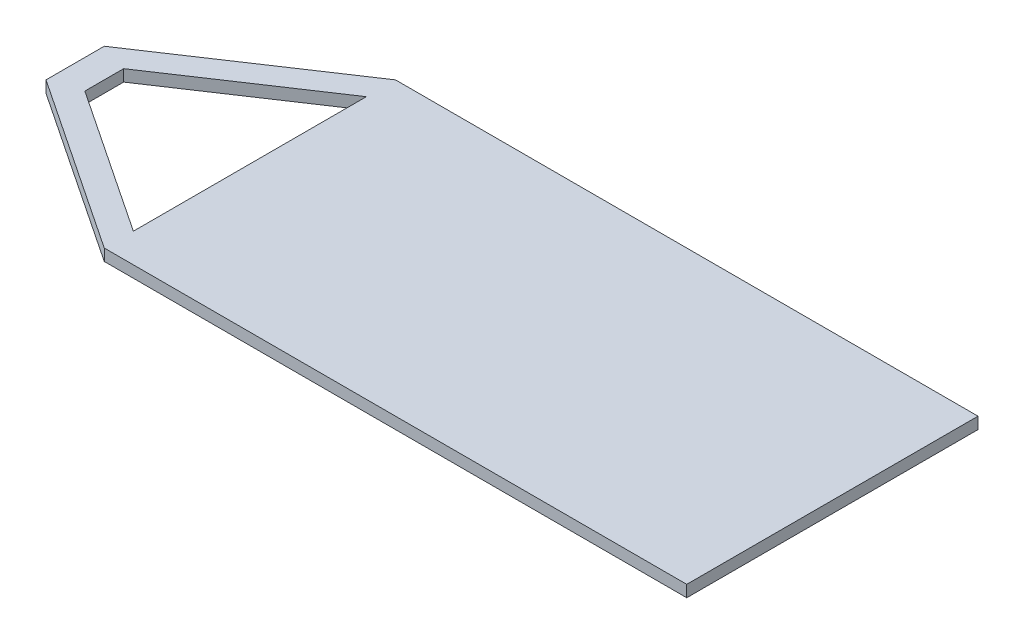
ISO-10303-21;
HEADER;
FILE_DESCRIPTION(('STEP AP214'),'2;1');
FILE_NAME('part.step','',(''),(''),'','','');
FILE_SCHEMA(('AUTOMOTIVE_DESIGN { 1 0 10303 214 1 1 1 1 }'));
ENDSEC;
DATA;
#1=APPLICATION_CONTEXT('core data for automotive mechanical design processes');
#2=APPLICATION_PROTOCOL_DEFINITION('international standard','automotive_design',2000,#1);
#3=PRODUCT_CONTEXT('',#1,'mechanical');
#4=PRODUCT('Part','Part','',(#3));
#5=PRODUCT_RELATED_PRODUCT_CATEGORY('part','',(#4));
#6=PRODUCT_DEFINITION_FORMATION('','',#4);
#7=PRODUCT_DEFINITION_CONTEXT('part definition',#1,'design');
#8=PRODUCT_DEFINITION('design','',#6,#7);
#9=PRODUCT_DEFINITION_SHAPE('','',#8);
#10=(LENGTH_UNIT() NAMED_UNIT(*) SI_UNIT(.MILLI.,.METRE.));
#11=(NAMED_UNIT(*) PLANE_ANGLE_UNIT() SI_UNIT($,.RADIAN.));
#12=(NAMED_UNIT(*) SI_UNIT($,.STERADIAN.) SOLID_ANGLE_UNIT());
#13=UNCERTAINTY_MEASURE_WITH_UNIT(LENGTH_MEASURE(1.E-05),#10,'distance_accuracy_value','');
#14=(GEOMETRIC_REPRESENTATION_CONTEXT(3) GLOBAL_UNCERTAINTY_ASSIGNED_CONTEXT((#13)) GLOBAL_UNIT_ASSIGNED_CONTEXT((#10,
#11,#12)) REPRESENTATION_CONTEXT('',''));
#15=CARTESIAN_POINT('',(0.,0.,0.));
#16=DIRECTION('',(0.,0.,1.));
#17=DIRECTION('',(1.,0.,0.));
#18=AXIS2_PLACEMENT_3D('',#15,#16,#17);
#19=CARTESIAN_POINT('',(0.,2.,0.));
#20=DIRECTION('',(0.,1.,0.));
#21=DIRECTION('',(0.,0.,1.));
#22=AXIS2_PLACEMENT_3D('',#19,#20,#21);
#23=PLANE('',#22);
#24=DIRECTION('',(0.832050294337844,0.,0.554700196225229));
#25=VECTOR('',#24,1.);
#26=CARTESIAN_POINT('',(0.,2.,5.));
#27=LINE('',#26,#25);
#28=CARTESIAN_POINT('',(0.,2.,5.));
#29=VERTEX_POINT('',#28);
#30=CARTESIAN_POINT('',(30.,2.,25.));
#31=VERTEX_POINT('',#30);
#32=EDGE_CURVE('E151',#29,#31,#27,.T.);
#33=ORIENTED_EDGE('',*,*,#32,.T.);
#34=DIRECTION('',(1.,0.,0.));
#35=VECTOR('',#34,1.);
#36=CARTESIAN_POINT('',(30.,2.,25.));
#37=LINE('',#36,#35);
#38=CARTESIAN_POINT('',(130.,2.,24.9999999999999));
#39=VERTEX_POINT('',#38);
#40=EDGE_CURVE('E154',#31,#39,#37,.T.);
#41=ORIENTED_EDGE('',*,*,#40,.T.);
#42=DIRECTION('',(0.,0.,-1.));
#43=VECTOR('',#42,1.);
#44=CARTESIAN_POINT('',(130.,2.,24.9999999999999));
#45=LINE('',#44,#43);
#46=CARTESIAN_POINT('',(130.,2.,-25.));
#47=VERTEX_POINT('',#46);
#48=EDGE_CURVE('E157',#39,#47,#45,.T.);
#49=ORIENTED_EDGE('',*,*,#48,.T.);
#50=DIRECTION('',(-1.,0.,0.));
#51=VECTOR('',#50,1.);
#52=CARTESIAN_POINT('',(30.,2.,-25.));
#53=LINE('',#52,#51);
#54=CARTESIAN_POINT('',(30.,2.,-25.));
#55=VERTEX_POINT('',#54);
#56=EDGE_CURVE('E159',#47,#55,#53,.T.);
#57=ORIENTED_EDGE('',*,*,#56,.T.);
#58=DIRECTION('',(-0.832050294337843,0.,0.55470019622523));
#59=VECTOR('',#58,1.);
#60=CARTESIAN_POINT('',(0.,2.,-5.));
#61=LINE('',#60,#59);
#62=CARTESIAN_POINT('',(0.,2.,-5.));
#63=VERTEX_POINT('',#62);
#64=EDGE_CURVE('E161',#55,#63,#61,.T.);
#65=ORIENTED_EDGE('',*,*,#64,.T.);
#66=DIRECTION('',(0.,0.,1.));
#67=VECTOR('',#66,1.);
#68=CARTESIAN_POINT('',(0.,2.,-5.));
#69=LINE('',#68,#67);
#70=EDGE_CURVE('E163',#63,#29,#69,.T.);
#71=ORIENTED_EDGE('',*,*,#70,.T.);
#72=EDGE_LOOP('',(#33,#41,#49,#57,#65,#71));
#73=FACE_BOUND('',#72,.T.);
#74=DIRECTION('',(0.,0.,1.));
#75=VECTOR('',#74,1.);
#76=CARTESIAN_POINT('',(5.,2.,-3.33333333333332));
#77=LINE('',#76,#75);
#78=CARTESIAN_POINT('',(5.,2.,-3.33333333333332));
#79=VERTEX_POINT('',#78);
#80=CARTESIAN_POINT('',(5.,2.,3.33333333333333));
#81=VERTEX_POINT('',#80);
#82=EDGE_CURVE('E123',#79,#81,#77,.T.);
#83=ORIENTED_EDGE('',*,*,#82,.F.);
#84=DIRECTION('',(-0.832050294337843,0.,0.55470019622523));
#85=VECTOR('',#84,1.);
#86=CARTESIAN_POINT('',(5.,2.,-3.33333333333332));
#87=LINE('',#86,#85);
#88=CARTESIAN_POINT('',(30.,2.,-20.));
#89=VERTEX_POINT('',#88);
#90=EDGE_CURVE('E115',#89,#79,#87,.T.);
#91=ORIENTED_EDGE('',*,*,#90,.F.);
#92=DIRECTION('',(0.,0.,-1.));
#93=VECTOR('',#92,1.);
#94=CARTESIAN_POINT('',(30.,2.,20.));
#95=LINE('',#94,#93);
#96=CARTESIAN_POINT('',(30.,2.,20.));
#97=VERTEX_POINT('',#96);
#98=EDGE_CURVE('E137',#97,#89,#95,.T.);
#99=ORIENTED_EDGE('',*,*,#98,.F.);
#100=DIRECTION('',(0.832050294337844,0.,0.554700196225229));
#101=VECTOR('',#100,1.);
#102=CARTESIAN_POINT('',(5.,2.,3.33333333333333));
#103=LINE('',#102,#101);
#104=EDGE_CURVE('E135',#81,#97,#103,.T.);
#105=ORIENTED_EDGE('',*,*,#104,.F.);
#106=EDGE_LOOP('',(#83,#91,#99,#105));
#107=FACE_BOUND('',#106,.T.);
#108=ADVANCED_FACE('F38',(#73,#107),#23,.T.);
#109=CARTESIAN_POINT('',(0.,0.,0.));
#110=DIRECTION('',(0.,1.,0.));
#111=DIRECTION('',(0.,0.,1.));
#112=AXIS2_PLACEMENT_3D('',#109,#110,#111);
#113=PLANE('',#112);
#114=DIRECTION('',(0.832050294337844,0.,0.554700196225229));
#115=VECTOR('',#114,1.);
#116=CARTESIAN_POINT('',(0.,0.,5.));
#117=LINE('',#116,#115);
#118=CARTESIAN_POINT('',(0.,0.,5.));
#119=VERTEX_POINT('',#118);
#120=CARTESIAN_POINT('',(30.,0.,25.));
#121=VERTEX_POINT('',#120);
#122=EDGE_CURVE('E131',#119,#121,#117,.T.);
#123=ORIENTED_EDGE('',*,*,#122,.F.);
#124=DIRECTION('',(0.,0.,1.));
#125=VECTOR('',#124,1.);
#126=CARTESIAN_POINT('',(0.,0.,-5.));
#127=LINE('',#126,#125);
#128=CARTESIAN_POINT('',(0.,0.,-5.));
#129=VERTEX_POINT('',#128);
#130=EDGE_CURVE('E155',#129,#119,#127,.T.);
#131=ORIENTED_EDGE('',*,*,#130,.F.);
#132=DIRECTION('',(-0.832050294337843,0.,0.55470019622523));
#133=VECTOR('',#132,1.);
#134=CARTESIAN_POINT('',(0.,0.,-5.));
#135=LINE('',#134,#133);
#136=CARTESIAN_POINT('',(30.,0.,-25.));
#137=VERTEX_POINT('',#136);
#138=EDGE_CURVE('E174',#137,#129,#135,.T.);
#139=ORIENTED_EDGE('',*,*,#138,.F.);
#140=DIRECTION('',(-1.,0.,0.));
#141=VECTOR('',#140,1.);
#142=CARTESIAN_POINT('',(30.,0.,-25.));
#143=LINE('',#142,#141);
#144=CARTESIAN_POINT('',(130.,0.,-25.));
#145=VERTEX_POINT('',#144);
#146=EDGE_CURVE('E172',#145,#137,#143,.T.);
#147=ORIENTED_EDGE('',*,*,#146,.F.);
#148=DIRECTION('',(0.,0.,-1.));
#149=VECTOR('',#148,1.);
#150=CARTESIAN_POINT('',(130.,0.,24.9999999999999));
#151=LINE('',#150,#149);
#152=CARTESIAN_POINT('',(130.,0.,24.9999999999999));
#153=VERTEX_POINT('',#152);
#154=EDGE_CURVE('E170',#153,#145,#151,.T.);
#155=ORIENTED_EDGE('',*,*,#154,.F.);
#156=DIRECTION('',(1.,0.,0.));
#157=VECTOR('',#156,1.);
#158=CARTESIAN_POINT('',(30.,0.,25.));
#159=LINE('',#158,#157);
#160=EDGE_CURVE('E168',#121,#153,#159,.T.);
#161=ORIENTED_EDGE('',*,*,#160,.F.);
#162=EDGE_LOOP('',(#123,#131,#139,#147,#155,#161));
#163=FACE_BOUND('',#162,.T.);
#164=DIRECTION('',(-0.832050294337843,0.,0.55470019622523));
#165=VECTOR('',#164,1.);
#166=CARTESIAN_POINT('',(5.,0.,-3.33333333333332));
#167=LINE('',#166,#165);
#168=CARTESIAN_POINT('',(30.,0.,-20.));
#169=VERTEX_POINT('',#168);
#170=CARTESIAN_POINT('',(5.,0.,-3.33333333333332));
#171=VERTEX_POINT('',#170);
#172=EDGE_CURVE('E61',#169,#171,#167,.T.);
#173=ORIENTED_EDGE('',*,*,#172,.T.);
#174=DIRECTION('',(0.,0.,1.));
#175=VECTOR('',#174,1.);
#176=CARTESIAN_POINT('',(5.,0.,-3.33333333333332));
#177=LINE('',#176,#175);
#178=CARTESIAN_POINT('',(5.,0.,3.33333333333333));
#179=VERTEX_POINT('',#178);
#180=EDGE_CURVE('E130',#171,#179,#177,.T.);
#181=ORIENTED_EDGE('',*,*,#180,.T.);
#182=DIRECTION('',(0.832050294337844,0.,0.554700196225229));
#183=VECTOR('',#182,1.);
#184=CARTESIAN_POINT('',(5.,0.,3.33333333333333));
#185=LINE('',#184,#183);
#186=CARTESIAN_POINT('',(30.,0.,20.));
#187=VERTEX_POINT('',#186);
#188=EDGE_CURVE('E143',#179,#187,#185,.T.);
#189=ORIENTED_EDGE('',*,*,#188,.T.);
#190=DIRECTION('',(0.,0.,-1.));
#191=VECTOR('',#190,1.);
#192=CARTESIAN_POINT('',(30.,0.,20.));
#193=LINE('',#192,#191);
#194=EDGE_CURVE('E124',#187,#169,#193,.T.);
#195=ORIENTED_EDGE('',*,*,#194,.T.);
#196=EDGE_LOOP('',(#173,#181,#189,#195));
#197=FACE_BOUND('',#196,.T.);
#198=ADVANCED_FACE('F198',(#163,#197),#113,.F.);
#199=CARTESIAN_POINT('',(0.,2.,5.));
#200=DIRECTION('',(0.554700196225229,0.,-0.832050294337844));
#201=DIRECTION('',(-0.832050294337844,0.,-0.554700196225229));
#202=AXIS2_PLACEMENT_3D('',#199,#200,#201);
#203=PLANE('',#202);
#204=ORIENTED_EDGE('',*,*,#122,.T.);
#205=DIRECTION('',(0.,-1.,0.));
#206=VECTOR('',#205,1.);
#207=CARTESIAN_POINT('',(30.,2.,25.));
#208=LINE('',#207,#206);
#209=EDGE_CURVE('E11',#31,#121,#208,.T.);
#210=ORIENTED_EDGE('',*,*,#209,.F.);
#211=ORIENTED_EDGE('',*,*,#32,.F.);
#212=DIRECTION('',(0.,-1.,0.));
#213=VECTOR('',#212,1.);
#214=CARTESIAN_POINT('',(0.,2.,5.));
#215=LINE('',#214,#213);
#216=EDGE_CURVE('E165',#29,#119,#215,.T.);
#217=ORIENTED_EDGE('',*,*,#216,.T.);
#218=EDGE_LOOP('',(#204,#210,#211,#217));
#219=FACE_BOUND('',#218,.T.);
#220=ADVANCED_FACE('F40',(#219),#203,.F.);
#221=CARTESIAN_POINT('',(30.,2.,25.));
#222=DIRECTION('',(0.,0.,-1.));
#223=DIRECTION('',(-1.,0.,0.));
#224=AXIS2_PLACEMENT_3D('',#221,#222,#223);
#225=PLANE('',#224);
#226=ORIENTED_EDGE('',*,*,#160,.T.);
#227=DIRECTION('',(0.,-1.,0.));
#228=VECTOR('',#227,1.);
#229=CARTESIAN_POINT('',(130.,2.,24.9999999999999));
#230=LINE('',#229,#228);
#231=EDGE_CURVE('E46',#39,#153,#230,.T.);
#232=ORIENTED_EDGE('',*,*,#231,.F.);
#233=ORIENTED_EDGE('',*,*,#40,.F.);
#234=ORIENTED_EDGE('',*,*,#209,.T.);
#235=EDGE_LOOP('',(#226,#232,#233,#234));
#236=FACE_BOUND('',#235,.T.);
#237=ADVANCED_FACE('F215',(#236),#225,.F.);
#238=CARTESIAN_POINT('',(130.,2.,24.9999999999999));
#239=DIRECTION('',(-1.,0.,0.));
#240=DIRECTION('',(0.,0.,1.));
#241=AXIS2_PLACEMENT_3D('',#238,#239,#240);
#242=PLANE('',#241);
#243=ORIENTED_EDGE('',*,*,#154,.T.);
#244=DIRECTION('',(0.,-1.,0.));
#245=VECTOR('',#244,1.);
#246=CARTESIAN_POINT('',(130.,2.,-25.));
#247=LINE('',#246,#245);
#248=EDGE_CURVE('E185',#47,#145,#247,.T.);
#249=ORIENTED_EDGE('',*,*,#248,.F.);
#250=ORIENTED_EDGE('',*,*,#48,.F.);
#251=ORIENTED_EDGE('',*,*,#231,.T.);
#252=EDGE_LOOP('',(#243,#249,#250,#251));
#253=FACE_BOUND('',#252,.T.);
#254=ADVANCED_FACE('F192',(#253),#242,.F.);
#255=CARTESIAN_POINT('',(30.,2.,-25.));
#256=DIRECTION('',(0.,0.,1.));
#257=DIRECTION('',(1.,0.,0.));
#258=AXIS2_PLACEMENT_3D('',#255,#256,#257);
#259=PLANE('',#258);
#260=ORIENTED_EDGE('',*,*,#146,.T.);
#261=DIRECTION('',(0.,-1.,0.));
#262=VECTOR('',#261,1.);
#263=CARTESIAN_POINT('',(30.,2.,-25.));
#264=LINE('',#263,#262);
#265=EDGE_CURVE('E182',#55,#137,#264,.T.);
#266=ORIENTED_EDGE('',*,*,#265,.F.);
#267=ORIENTED_EDGE('',*,*,#56,.F.);
#268=ORIENTED_EDGE('',*,*,#248,.T.);
#269=EDGE_LOOP('',(#260,#266,#267,#268));
#270=FACE_BOUND('',#269,.T.);
#271=ADVANCED_FACE('F204',(#270),#259,.F.);
#272=CARTESIAN_POINT('',(0.,2.,-5.));
#273=DIRECTION('',(0.55470019622523,0.,0.832050294337843));
#274=DIRECTION('',(0.832050294337843,0.,-0.55470019622523));
#275=AXIS2_PLACEMENT_3D('',#272,#273,#274);
#276=PLANE('',#275);
#277=ORIENTED_EDGE('',*,*,#138,.T.);
#278=DIRECTION('',(0.,-1.,0.));
#279=VECTOR('',#278,1.);
#280=CARTESIAN_POINT('',(0.,2.,-5.));
#281=LINE('',#280,#279);
#282=EDGE_CURVE('E179',#63,#129,#281,.T.);
#283=ORIENTED_EDGE('',*,*,#282,.F.);
#284=ORIENTED_EDGE('',*,*,#64,.F.);
#285=ORIENTED_EDGE('',*,*,#265,.T.);
#286=EDGE_LOOP('',(#277,#283,#284,#285));
#287=FACE_BOUND('',#286,.T.);
#288=ADVANCED_FACE('F208',(#287),#276,.F.);
#289=CARTESIAN_POINT('',(0.,2.,-5.));
#290=DIRECTION('',(1.,0.,0.));
#291=DIRECTION('',(0.,0.,-1.));
#292=AXIS2_PLACEMENT_3D('',#289,#290,#291);
#293=PLANE('',#292);
#294=ORIENTED_EDGE('',*,*,#130,.T.);
#295=ORIENTED_EDGE('',*,*,#216,.F.);
#296=ORIENTED_EDGE('',*,*,#70,.F.);
#297=ORIENTED_EDGE('',*,*,#282,.T.);
#298=EDGE_LOOP('',(#294,#295,#296,#297));
#299=FACE_BOUND('',#298,.T.);
#300=ADVANCED_FACE('F218',(#299),#293,.F.);
#301=CARTESIAN_POINT('',(5.,2.,-3.33333333333332));
#302=DIRECTION('',(0.55470019622523,0.,0.832050294337843));
#303=DIRECTION('',(0.832050294337843,0.,-0.55470019622523));
#304=AXIS2_PLACEMENT_3D('',#301,#302,#303);
#305=PLANE('',#304);
#306=ORIENTED_EDGE('',*,*,#172,.F.);
#307=DIRECTION('',(0.,-1.,0.));
#308=VECTOR('',#307,1.);
#309=CARTESIAN_POINT('',(30.,2.,-20.));
#310=LINE('',#309,#308);
#311=EDGE_CURVE('E119',#89,#169,#310,.T.);
#312=ORIENTED_EDGE('',*,*,#311,.F.);
#313=ORIENTED_EDGE('',*,*,#90,.T.);
#314=DIRECTION('',(0.,-1.,0.));
#315=VECTOR('',#314,1.);
#316=CARTESIAN_POINT('',(5.,2.,-3.33333333333332));
#317=LINE('',#316,#315);
#318=EDGE_CURVE('E118',#79,#171,#317,.T.);
#319=ORIENTED_EDGE('',*,*,#318,.T.);
#320=EDGE_LOOP('',(#306,#312,#313,#319));
#321=FACE_BOUND('',#320,.T.);
#322=ADVANCED_FACE('F117',(#321),#305,.T.);
#323=CARTESIAN_POINT('',(5.,2.,-3.33333333333332));
#324=DIRECTION('',(1.,0.,0.));
#325=DIRECTION('',(0.,0.,-1.));
#326=AXIS2_PLACEMENT_3D('',#323,#324,#325);
#327=PLANE('',#326);
#328=ORIENTED_EDGE('',*,*,#180,.F.);
#329=ORIENTED_EDGE('',*,*,#318,.F.);
#330=ORIENTED_EDGE('',*,*,#82,.T.);
#331=DIRECTION('',(0.,-1.,0.));
#332=VECTOR('',#331,1.);
#333=CARTESIAN_POINT('',(5.,2.,3.33333333333333));
#334=LINE('',#333,#332);
#335=EDGE_CURVE('E132',#81,#179,#334,.T.);
#336=ORIENTED_EDGE('',*,*,#335,.T.);
#337=EDGE_LOOP('',(#328,#329,#330,#336));
#338=FACE_BOUND('',#337,.T.);
#339=ADVANCED_FACE('F127',(#338),#327,.T.);
#340=CARTESIAN_POINT('',(5.,2.,3.33333333333333));
#341=DIRECTION('',(0.554700196225229,0.,-0.832050294337844));
#342=DIRECTION('',(-0.832050294337844,0.,-0.554700196225229));
#343=AXIS2_PLACEMENT_3D('',#340,#341,#342);
#344=PLANE('',#343);
#345=ORIENTED_EDGE('',*,*,#188,.F.);
#346=ORIENTED_EDGE('',*,*,#335,.F.);
#347=ORIENTED_EDGE('',*,*,#104,.T.);
#348=DIRECTION('',(0.,-1.,0.));
#349=VECTOR('',#348,1.);
#350=CARTESIAN_POINT('',(30.,2.,20.));
#351=LINE('',#350,#349);
#352=EDGE_CURVE('E53',#97,#187,#351,.T.);
#353=ORIENTED_EDGE('',*,*,#352,.T.);
#354=EDGE_LOOP('',(#345,#346,#347,#353));
#355=FACE_BOUND('',#354,.T.);
#356=ADVANCED_FACE('F236',(#355),#344,.T.);
#357=CARTESIAN_POINT('',(30.,2.,20.));
#358=DIRECTION('',(-1.,0.,0.));
#359=DIRECTION('',(0.,0.,1.));
#360=AXIS2_PLACEMENT_3D('',#357,#358,#359);
#361=PLANE('',#360);
#362=ORIENTED_EDGE('',*,*,#194,.F.);
#363=ORIENTED_EDGE('',*,*,#352,.F.);
#364=ORIENTED_EDGE('',*,*,#98,.T.);
#365=ORIENTED_EDGE('',*,*,#311,.T.);
#366=EDGE_LOOP('',(#362,#363,#364,#365));
#367=FACE_BOUND('',#366,.T.);
#368=ADVANCED_FACE('F239',(#367),#361,.T.);
#369=CLOSED_SHELL('',(#108,#198,#220,#237,#254,#271,#288,#300,#322,#339,#356,#368));
#370=MANIFOLD_SOLID_BREP('B2',#369);
#371=ADVANCED_BREP_SHAPE_REPRESENTATION('',(#18,#370),#14);
#372=SHAPE_DEFINITION_REPRESENTATION(#9,#371);
ENDSEC;
END-ISO-10303-21;
